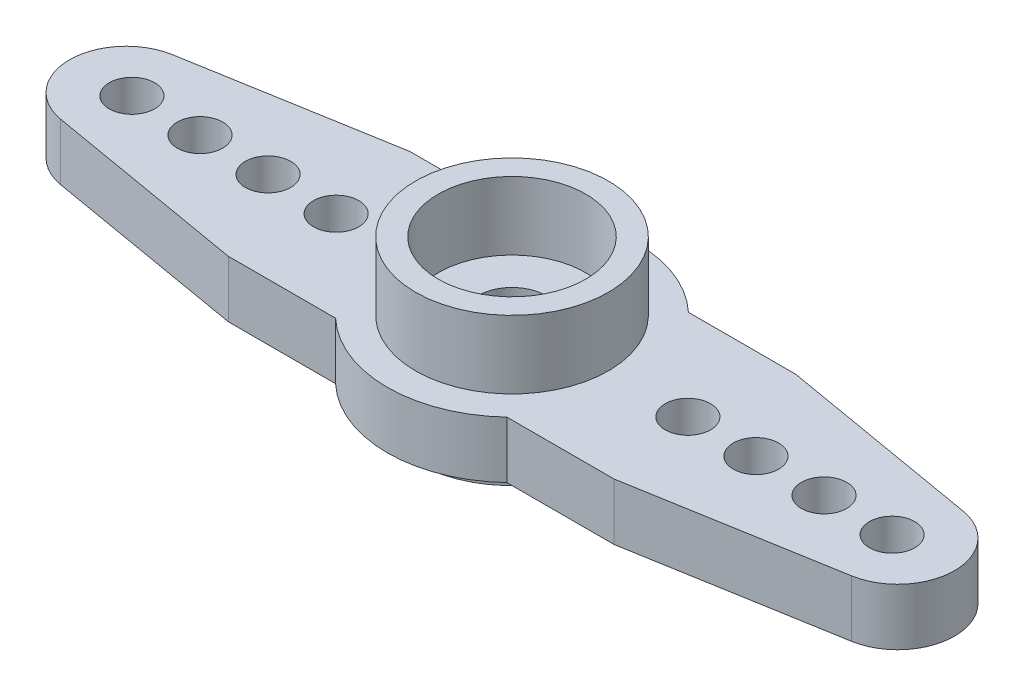
ISO-10303-21;
HEADER;
FILE_DESCRIPTION(('STEP AP214'),'2;1');
FILE_NAME('part.step','',(''),(''),'','','');
FILE_SCHEMA(('AUTOMOTIVE_DESIGN { 1 0 10303 214 1 1 1 1 }'));
ENDSEC;
DATA;
#1=APPLICATION_CONTEXT('core data for automotive mechanical design processes');
#2=APPLICATION_PROTOCOL_DEFINITION('international standard','automotive_design',2000,#1);
#3=PRODUCT_CONTEXT('',#1,'mechanical');
#4=PRODUCT('Part','Part','',(#3));
#5=PRODUCT_RELATED_PRODUCT_CATEGORY('part','',(#4));
#6=PRODUCT_DEFINITION_FORMATION('','',#4);
#7=PRODUCT_DEFINITION_CONTEXT('part definition',#1,'design');
#8=PRODUCT_DEFINITION('design','',#6,#7);
#9=PRODUCT_DEFINITION_SHAPE('','',#8);
#10=(LENGTH_UNIT() NAMED_UNIT(*) SI_UNIT(.MILLI.,.METRE.));
#11=(NAMED_UNIT(*) PLANE_ANGLE_UNIT() SI_UNIT($,.RADIAN.));
#12=(NAMED_UNIT(*) SI_UNIT($,.STERADIAN.) SOLID_ANGLE_UNIT());
#13=UNCERTAINTY_MEASURE_WITH_UNIT(LENGTH_MEASURE(1.E-05),#10,'distance_accuracy_value','');
#14=(GEOMETRIC_REPRESENTATION_CONTEXT(3) GLOBAL_UNCERTAINTY_ASSIGNED_CONTEXT((#13)) GLOBAL_UNIT_ASSIGNED_CONTEXT((#10,
#11,#12)) REPRESENTATION_CONTEXT('',''));
#15=CARTESIAN_POINT('',(0.,0.,0.));
#16=DIRECTION('',(0.,0.,1.));
#17=DIRECTION('',(1.,0.,0.));
#18=AXIS2_PLACEMENT_3D('',#15,#16,#17);
#19=CARTESIAN_POINT('',(17.,1.25,0.));
#20=DIRECTION('',(0.,-1.,0.));
#21=DIRECTION('',(0.,0.,-1.));
#22=AXIS2_PLACEMENT_3D('',#19,#20,#21);
#23=CYLINDRICAL_SURFACE('',#22,2.5);
#24=CARTESIAN_POINT('',(17.,-1.25,0.));
#25=DIRECTION('',(0.,1.,0.));
#26=DIRECTION('',(0.,0.,1.));
#27=AXIS2_PLACEMENT_3D('',#24,#25,#26);
#28=CIRCLE('',#27,2.5);
#29=CARTESIAN_POINT('',(17.4241229618286,-1.25,-2.46376129388578));
#30=VERTEX_POINT('',#29);
#31=CARTESIAN_POINT('',(17.4241229618286,-1.25,2.46376129388578));
#32=VERTEX_POINT('',#31);
#33=EDGE_CURVE('E274',#30,#32,#28,.F.);
#34=ORIENTED_EDGE('',*,*,#33,.F.);
#35=DIRECTION('',(0.,-1.,0.));
#36=VECTOR('',#35,1.);
#37=CARTESIAN_POINT('',(17.4241229618286,1.25,-2.46376129388578));
#38=LINE('',#37,#36);
#39=CARTESIAN_POINT('',(17.4241229618286,1.25,-2.46376129388578));
#40=VERTEX_POINT('',#39);
#41=EDGE_CURVE('E114',#40,#30,#38,.T.);
#42=ORIENTED_EDGE('',*,*,#41,.F.);
#43=CARTESIAN_POINT('',(17.,1.25,0.));
#44=DIRECTION('',(0.,1.,0.));
#45=DIRECTION('',(0.,0.,1.));
#46=AXIS2_PLACEMENT_3D('',#43,#44,#45);
#47=CIRCLE('',#46,2.5);
#48=CARTESIAN_POINT('',(17.4241229618286,1.25,2.46376129388578));
#49=VERTEX_POINT('',#48);
#50=EDGE_CURVE('E338',#40,#49,#47,.F.);
#51=ORIENTED_EDGE('',*,*,#50,.T.);
#52=DIRECTION('',(0.,-1.,0.));
#53=VECTOR('',#52,1.);
#54=CARTESIAN_POINT('',(17.4241229618286,1.25,2.46376129388578));
#55=LINE('',#54,#53);
#56=EDGE_CURVE('E110',#49,#32,#55,.T.);
#57=ORIENTED_EDGE('',*,*,#56,.T.);
#58=EDGE_LOOP('',(#34,#42,#51,#57));
#59=FACE_BOUND('',#58,.T.);
#60=ADVANCED_FACE('F44',(#59),#23,.T.);
#61=CARTESIAN_POINT('',(0.913397341789327,1.25,-5.30599193907388));
#62=DIRECTION('',(0.169649184731441,0.,-0.985504517554312));
#63=DIRECTION('',(-0.985504517554312,0.,-0.169649184731441));
#64=AXIS2_PLACEMENT_3D('',#61,#62,#63);
#65=PLANE('',#64);
#66=DIRECTION('',(0.985504517554312,0.,0.169649184731441));
#67=VECTOR('',#66,1.);
#68=CARTESIAN_POINT('',(0.913397341789327,-1.25,-5.30599193907388));
#69=LINE('',#68,#67);
#70=CARTESIAN_POINT('',(8.5,-1.25,-4.));
#71=VERTEX_POINT('',#70);
#72=EDGE_CURVE('E276',#71,#30,#69,.T.);
#73=ORIENTED_EDGE('',*,*,#72,.F.);
#74=DIRECTION('',(0.,-1.,0.));
#75=VECTOR('',#74,1.);
#76=CARTESIAN_POINT('',(8.5,1.25,-4.));
#77=LINE('',#76,#75);
#78=CARTESIAN_POINT('',(8.5,1.25,-4.));
#79=VERTEX_POINT('',#78);
#80=EDGE_CURVE('E183',#79,#71,#77,.T.);
#81=ORIENTED_EDGE('',*,*,#80,.F.);
#82=DIRECTION('',(0.985504517554312,0.,0.169649184731441));
#83=VECTOR('',#82,1.);
#84=CARTESIAN_POINT('',(0.913397341789327,1.25,-5.30599193907388));
#85=LINE('',#84,#83);
#86=EDGE_CURVE('E335',#79,#40,#85,.T.);
#87=ORIENTED_EDGE('',*,*,#86,.T.);
#88=ORIENTED_EDGE('',*,*,#41,.T.);
#89=EDGE_LOOP('',(#73,#81,#87,#88));
#90=FACE_BOUND('',#89,.T.);
#91=ADVANCED_FACE('F214',(#90),#65,.T.);
#92=CARTESIAN_POINT('',(0.,1.25,-4.));
#93=DIRECTION('',(0.,0.,-1.));
#94=DIRECTION('',(-1.,0.,0.));
#95=AXIS2_PLACEMENT_3D('',#92,#93,#94);
#96=PLANE('',#95);
#97=DIRECTION('',(1.,0.,0.));
#98=VECTOR('',#97,1.);
#99=CARTESIAN_POINT('',(0.,-1.25,-4.));
#100=LINE('',#99,#98);
#101=CARTESIAN_POINT('',(3.77491721763537,-1.25,-4.));
#102=VERTEX_POINT('',#101);
#103=EDGE_CURVE('E279',#102,#71,#100,.T.);
#104=ORIENTED_EDGE('',*,*,#103,.F.);
#105=DIRECTION('',(0.,-1.,0.));
#106=VECTOR('',#105,1.);
#107=CARTESIAN_POINT('',(3.77491721763537,1.25,-4.));
#108=LINE('',#107,#106);
#109=CARTESIAN_POINT('',(3.77491721763537,1.25,-4.));
#110=VERTEX_POINT('',#109);
#111=EDGE_CURVE('E181',#110,#102,#108,.T.);
#112=ORIENTED_EDGE('',*,*,#111,.F.);
#113=DIRECTION('',(1.,0.,0.));
#114=VECTOR('',#113,1.);
#115=CARTESIAN_POINT('',(0.,1.25,-4.));
#116=LINE('',#115,#114);
#117=EDGE_CURVE('E332',#110,#79,#116,.T.);
#118=ORIENTED_EDGE('',*,*,#117,.T.);
#119=ORIENTED_EDGE('',*,*,#80,.T.);
#120=EDGE_LOOP('',(#104,#112,#118,#119));
#121=FACE_BOUND('',#120,.T.);
#122=ADVANCED_FACE('F219',(#121),#96,.T.);
#123=CARTESIAN_POINT('',(0.,1.25,0.));
#124=DIRECTION('',(0.,-1.,0.));
#125=DIRECTION('',(0.,0.,-1.));
#126=AXIS2_PLACEMENT_3D('',#123,#124,#125);
#127=CYLINDRICAL_SURFACE('',#126,5.5);
#128=CARTESIAN_POINT('',(0.,-1.25,0.));
#129=DIRECTION('',(0.,1.,0.));
#130=DIRECTION('',(0.,0.,1.));
#131=AXIS2_PLACEMENT_3D('',#128,#129,#130);
#132=CIRCLE('',#131,5.5);
#133=CARTESIAN_POINT('',(-3.77491721763537,-1.25,-4.));
#134=VERTEX_POINT('',#133);
#135=EDGE_CURVE('E282',#102,#134,#132,.T.);
#136=ORIENTED_EDGE('',*,*,#135,.T.);
#137=DIRECTION('',(0.,-1.,0.));
#138=VECTOR('',#137,1.);
#139=CARTESIAN_POINT('',(-3.77491721763537,1.25,-4.));
#140=LINE('',#139,#138);
#141=CARTESIAN_POINT('',(-3.77491721763537,1.25,-4.));
#142=VERTEX_POINT('',#141);
#143=EDGE_CURVE('E179',#142,#134,#140,.T.);
#144=ORIENTED_EDGE('',*,*,#143,.F.);
#145=CARTESIAN_POINT('',(0.,1.25,0.));
#146=DIRECTION('',(0.,1.,0.));
#147=DIRECTION('',(0.,0.,1.));
#148=AXIS2_PLACEMENT_3D('',#145,#146,#147);
#149=CIRCLE('',#148,5.5);
#150=EDGE_CURVE('E330',#110,#142,#149,.T.);
#151=ORIENTED_EDGE('',*,*,#150,.F.);
#152=ORIENTED_EDGE('',*,*,#111,.T.);
#153=EDGE_LOOP('',(#136,#144,#151,#152));
#154=FACE_BOUND('',#153,.T.);
#155=ADVANCED_FACE('F460',(#154),#127,.T.);
#156=CARTESIAN_POINT('',(-8.5,-1.25,-4.));
#157=VERTEX_POINT('',#156);
#158=EDGE_CURVE('E283',#157,#134,#100,.T.);
#159=ORIENTED_EDGE('',*,*,#158,.F.);
#160=DIRECTION('',(0.,-1.,0.));
#161=VECTOR('',#160,1.);
#162=CARTESIAN_POINT('',(-8.5,1.25,-4.));
#163=LINE('',#162,#161);
#164=CARTESIAN_POINT('',(-8.5,1.25,-4.));
#165=VERTEX_POINT('',#164);
#166=EDGE_CURVE('E177',#165,#157,#163,.T.);
#167=ORIENTED_EDGE('',*,*,#166,.F.);
#168=EDGE_CURVE('E329',#165,#142,#116,.T.);
#169=ORIENTED_EDGE('',*,*,#168,.T.);
#170=ORIENTED_EDGE('',*,*,#143,.T.);
#171=EDGE_LOOP('',(#159,#167,#169,#170));
#172=FACE_BOUND('',#171,.T.);
#173=ADVANCED_FACE('F457',(#172),#96,.T.);
#174=CARTESIAN_POINT('',(-0.913397341789327,1.25,-5.30599193907388));
#175=DIRECTION('',(0.169649184731441,0.,0.985504517554312));
#176=DIRECTION('',(0.985504517554312,0.,-0.169649184731441));
#177=AXIS2_PLACEMENT_3D('',#174,#175,#176);
#178=PLANE('',#177);
#179=DIRECTION('',(-0.985504517554312,0.,0.169649184731441));
#180=VECTOR('',#179,1.);
#181=CARTESIAN_POINT('',(-0.913397341789327,-1.25,-5.30599193907388));
#182=LINE('',#181,#180);
#183=CARTESIAN_POINT('',(-17.4241229618286,-1.25,-2.46376129388578));
#184=VERTEX_POINT('',#183);
#185=EDGE_CURVE('E286',#157,#184,#182,.T.);
#186=ORIENTED_EDGE('',*,*,#185,.T.);
#187=DIRECTION('',(0.,-1.,0.));
#188=VECTOR('',#187,1.);
#189=CARTESIAN_POINT('',(-17.4241229618286,1.25,-2.46376129388578));
#190=LINE('',#189,#188);
#191=CARTESIAN_POINT('',(-17.4241229618286,1.25,-2.46376129388578));
#192=VERTEX_POINT('',#191);
#193=EDGE_CURVE('E174',#192,#184,#190,.T.);
#194=ORIENTED_EDGE('',*,*,#193,.F.);
#195=DIRECTION('',(-0.985504517554312,0.,0.169649184731441));
#196=VECTOR('',#195,1.);
#197=CARTESIAN_POINT('',(-0.913397341789327,1.25,-5.30599193907388));
#198=LINE('',#197,#196);
#199=EDGE_CURVE('E326',#165,#192,#198,.T.);
#200=ORIENTED_EDGE('',*,*,#199,.F.);
#201=ORIENTED_EDGE('',*,*,#166,.T.);
#202=EDGE_LOOP('',(#186,#194,#200,#201));
#203=FACE_BOUND('',#202,.T.);
#204=ADVANCED_FACE('F453',(#203),#178,.F.);
#205=CARTESIAN_POINT('',(-17.,1.25,0.));
#206=DIRECTION('',(0.,-1.,0.));
#207=DIRECTION('',(0.,0.,-1.));
#208=AXIS2_PLACEMENT_3D('',#205,#206,#207);
#209=CYLINDRICAL_SURFACE('',#208,2.5);
#210=CARTESIAN_POINT('',(-17.,-1.25,0.));
#211=DIRECTION('',(0.,1.,0.));
#212=DIRECTION('',(0.,0.,1.));
#213=AXIS2_PLACEMENT_3D('',#210,#211,#212);
#214=CIRCLE('',#213,2.5);
#215=CARTESIAN_POINT('',(-17.4241229618286,-1.25,2.46376129388578));
#216=VERTEX_POINT('',#215);
#217=EDGE_CURVE('E289',#184,#216,#214,.T.);
#218=ORIENTED_EDGE('',*,*,#217,.T.);
#219=DIRECTION('',(0.,-1.,0.));
#220=VECTOR('',#219,1.);
#221=CARTESIAN_POINT('',(-17.4241229618286,1.25,2.46376129388578));
#222=LINE('',#221,#220);
#223=CARTESIAN_POINT('',(-17.4241229618286,1.25,2.46376129388578));
#224=VERTEX_POINT('',#223);
#225=EDGE_CURVE('E172',#224,#216,#222,.T.);
#226=ORIENTED_EDGE('',*,*,#225,.F.);
#227=CARTESIAN_POINT('',(-17.,1.25,0.));
#228=DIRECTION('',(0.,1.,0.));
#229=DIRECTION('',(0.,0.,1.));
#230=AXIS2_PLACEMENT_3D('',#227,#228,#229);
#231=CIRCLE('',#230,2.5);
#232=EDGE_CURVE('E324',#192,#224,#231,.T.);
#233=ORIENTED_EDGE('',*,*,#232,.F.);
#234=ORIENTED_EDGE('',*,*,#193,.T.);
#235=EDGE_LOOP('',(#218,#226,#233,#234));
#236=FACE_BOUND('',#235,.T.);
#237=ADVANCED_FACE('F449',(#236),#209,.T.);
#238=CARTESIAN_POINT('',(-0.913397341789328,1.25,5.30599193907388));
#239=DIRECTION('',(-0.169649184731441,0.,0.985504517554312));
#240=DIRECTION('',(0.985504517554312,0.,0.169649184731441));
#241=AXIS2_PLACEMENT_3D('',#238,#239,#240);
#242=PLANE('',#241);
#243=DIRECTION('',(-0.985504517554312,0.,-0.169649184731441));
#244=VECTOR('',#243,1.);
#245=CARTESIAN_POINT('',(-0.913397341789328,-1.25,5.30599193907388));
#246=LINE('',#245,#244);
#247=CARTESIAN_POINT('',(-8.5,-1.25,4.));
#248=VERTEX_POINT('',#247);
#249=EDGE_CURVE('E292',#248,#216,#246,.T.);
#250=ORIENTED_EDGE('',*,*,#249,.F.);
#251=DIRECTION('',(0.,-1.,0.));
#252=VECTOR('',#251,1.);
#253=CARTESIAN_POINT('',(-8.5,1.25,4.));
#254=LINE('',#253,#252);
#255=CARTESIAN_POINT('',(-8.5,1.25,4.));
#256=VERTEX_POINT('',#255);
#257=EDGE_CURVE('E166',#256,#248,#254,.T.);
#258=ORIENTED_EDGE('',*,*,#257,.F.);
#259=DIRECTION('',(-0.985504517554312,0.,-0.169649184731441));
#260=VECTOR('',#259,1.);
#261=CARTESIAN_POINT('',(-0.913397341789328,1.25,5.30599193907388));
#262=LINE('',#261,#260);
#263=EDGE_CURVE('E321',#256,#224,#262,.T.);
#264=ORIENTED_EDGE('',*,*,#263,.T.);
#265=ORIENTED_EDGE('',*,*,#225,.T.);
#266=EDGE_LOOP('',(#250,#258,#264,#265));
#267=FACE_BOUND('',#266,.T.);
#268=ADVANCED_FACE('F446',(#267),#242,.T.);
#269=CARTESIAN_POINT('',(0.,1.25,4.));
#270=DIRECTION('',(0.,0.,-1.));
#271=DIRECTION('',(-1.,0.,0.));
#272=AXIS2_PLACEMENT_3D('',#269,#270,#271);
#273=PLANE('',#272);
#274=DIRECTION('',(1.,0.,0.));
#275=VECTOR('',#274,1.);
#276=CARTESIAN_POINT('',(0.,-1.25,4.));
#277=LINE('',#276,#275);
#278=CARTESIAN_POINT('',(-3.77491721763537,-1.25,4.));
#279=VERTEX_POINT('',#278);
#280=EDGE_CURVE('E295',#248,#279,#277,.T.);
#281=ORIENTED_EDGE('',*,*,#280,.T.);
#282=DIRECTION('',(0.,-1.,0.));
#283=VECTOR('',#282,1.);
#284=CARTESIAN_POINT('',(-3.77491721763537,1.25,4.));
#285=LINE('',#284,#283);
#286=CARTESIAN_POINT('',(-3.77491721763537,1.25,4.));
#287=VERTEX_POINT('',#286);
#288=EDGE_CURVE('E164',#287,#279,#285,.T.);
#289=ORIENTED_EDGE('',*,*,#288,.F.);
#290=DIRECTION('',(1.,0.,0.));
#291=VECTOR('',#290,1.);
#292=CARTESIAN_POINT('',(0.,1.25,4.));
#293=LINE('',#292,#291);
#294=EDGE_CURVE('E152',#256,#287,#293,.T.);
#295=ORIENTED_EDGE('',*,*,#294,.F.);
#296=ORIENTED_EDGE('',*,*,#257,.T.);
#297=EDGE_LOOP('',(#281,#289,#295,#296));
#298=FACE_BOUND('',#297,.T.);
#299=ADVANCED_FACE('F441',(#298),#273,.F.);
#300=CARTESIAN_POINT('',(0.,1.25,0.));
#301=DIRECTION('',(0.,-1.,0.));
#302=DIRECTION('',(0.,0.,-1.));
#303=AXIS2_PLACEMENT_3D('',#300,#301,#302);
#304=CYLINDRICAL_SURFACE('',#303,5.5);
#305=CARTESIAN_POINT('',(0.,-1.25,0.));
#306=DIRECTION('',(0.,1.,0.));
#307=DIRECTION('',(0.,0.,1.));
#308=AXIS2_PLACEMENT_3D('',#305,#306,#307);
#309=CIRCLE('',#308,5.5);
#310=CARTESIAN_POINT('',(3.77491721763537,-1.25,4.));
#311=VERTEX_POINT('',#310);
#312=EDGE_CURVE('E163',#279,#311,#309,.T.);
#313=ORIENTED_EDGE('',*,*,#312,.T.);
#314=DIRECTION('',(0.,-1.,0.));
#315=VECTOR('',#314,1.);
#316=CARTESIAN_POINT('',(3.77491721763537,1.25,4.));
#317=LINE('',#316,#315);
#318=CARTESIAN_POINT('',(3.77491721763537,1.25,4.));
#319=VERTEX_POINT('',#318);
#320=EDGE_CURVE('E147',#319,#311,#317,.T.);
#321=ORIENTED_EDGE('',*,*,#320,.F.);
#322=CARTESIAN_POINT('',(0.,1.25,0.));
#323=DIRECTION('',(0.,1.,0.));
#324=DIRECTION('',(0.,0.,1.));
#325=AXIS2_PLACEMENT_3D('',#322,#323,#324);
#326=CIRCLE('',#325,5.5);
#327=EDGE_CURVE('E150',#287,#319,#326,.T.);
#328=ORIENTED_EDGE('',*,*,#327,.F.);
#329=ORIENTED_EDGE('',*,*,#288,.T.);
#330=EDGE_LOOP('',(#313,#321,#328,#329));
#331=FACE_BOUND('',#330,.T.);
#332=ADVANCED_FACE('F162',(#331),#304,.T.);
#333=CARTESIAN_POINT('',(8.5,-1.25,4.));
#334=VERTEX_POINT('',#333);
#335=EDGE_CURVE('E298',#311,#334,#277,.T.);
#336=ORIENTED_EDGE('',*,*,#335,.T.);
#337=DIRECTION('',(0.,-1.,0.));
#338=VECTOR('',#337,1.);
#339=CARTESIAN_POINT('',(8.5,1.25,4.));
#340=LINE('',#339,#338);
#341=CARTESIAN_POINT('',(8.5,1.25,4.));
#342=VERTEX_POINT('',#341);
#343=EDGE_CURVE('E149',#342,#334,#340,.T.);
#344=ORIENTED_EDGE('',*,*,#343,.F.);
#345=EDGE_CURVE('E142',#319,#342,#293,.T.);
#346=ORIENTED_EDGE('',*,*,#345,.F.);
#347=ORIENTED_EDGE('',*,*,#320,.T.);
#348=EDGE_LOOP('',(#336,#344,#346,#347));
#349=FACE_BOUND('',#348,.T.);
#350=ADVANCED_FACE('F145',(#349),#273,.F.);
#351=CARTESIAN_POINT('',(-13.75,1.25,0.));
#352=DIRECTION('',(0.,-1.,0.));
#353=DIRECTION('',(0.,0.,-1.));
#354=AXIS2_PLACEMENT_3D('',#351,#352,#353);
#355=CYLINDRICAL_SURFACE('',#354,1.);
#356=CARTESIAN_POINT('',(-13.75,1.25,0.));
#357=DIRECTION('',(0.,1.,0.));
#358=DIRECTION('',(0.,0.,1.));
#359=AXIS2_PLACEMENT_3D('',#356,#357,#358);
#360=CIRCLE('',#359,1.);
#361=CARTESIAN_POINT('',(-13.75,1.25,1.));
#362=VERTEX_POINT('',#361);
#363=EDGE_CURVE('E311',#362,#362,#360,.F.);
#364=ORIENTED_EDGE('',*,*,#363,.F.);
#365=EDGE_LOOP('',(#364));
#366=FACE_BOUND('',#365,.T.);
#367=CARTESIAN_POINT('',(-13.75,-1.25,0.));
#368=DIRECTION('',(0.,1.,0.));
#369=DIRECTION('',(0.,0.,1.));
#370=AXIS2_PLACEMENT_3D('',#367,#368,#369);
#371=CIRCLE('',#370,1.);
#372=CARTESIAN_POINT('',(-13.75,-1.25,1.));
#373=VERTEX_POINT('',#372);
#374=EDGE_CURVE('E303',#373,#373,#371,.F.);
#375=ORIENTED_EDGE('',*,*,#374,.T.);
#376=EDGE_LOOP('',(#375));
#377=FACE_BOUND('',#376,.T.);
#378=ADVANCED_FACE('F430',(#366,#377),#355,.F.);
#379=CARTESIAN_POINT('',(0.913397341789328,1.25,5.30599193907388));
#380=DIRECTION('',(-0.169649184731441,0.,-0.985504517554312));
#381=DIRECTION('',(-0.985504517554312,0.,0.169649184731441));
#382=AXIS2_PLACEMENT_3D('',#379,#380,#381);
#383=PLANE('',#382);
#384=DIRECTION('',(0.985504517554312,0.,-0.169649184731441));
#385=VECTOR('',#384,1.);
#386=CARTESIAN_POINT('',(0.913397341789328,-1.25,5.30599193907388));
#387=LINE('',#386,#385);
#388=EDGE_CURVE('E103',#334,#32,#387,.T.);
#389=ORIENTED_EDGE('',*,*,#388,.T.);
#390=ORIENTED_EDGE('',*,*,#56,.F.);
#391=DIRECTION('',(0.985504517554312,0.,-0.169649184731441));
#392=VECTOR('',#391,1.);
#393=CARTESIAN_POINT('',(0.913397341789328,1.25,5.30599193907388));
#394=LINE('',#393,#392);
#395=EDGE_CURVE('E63',#342,#49,#394,.T.);
#396=ORIENTED_EDGE('',*,*,#395,.F.);
#397=ORIENTED_EDGE('',*,*,#343,.T.);
#398=EDGE_LOOP('',(#389,#390,#396,#397));
#399=FACE_BOUND('',#398,.T.);
#400=ADVANCED_FACE('F228',(#399),#383,.F.);
#401=CARTESIAN_POINT('',(7.75,1.25,0.));
#402=DIRECTION('',(0.,-1.,0.));
#403=DIRECTION('',(0.,0.,-1.));
#404=AXIS2_PLACEMENT_3D('',#401,#402,#403);
#405=CYLINDRICAL_SURFACE('',#404,1.);
#406=CARTESIAN_POINT('',(7.75,1.25,0.));
#407=DIRECTION('',(0.,1.,0.));
#408=DIRECTION('',(0.,0.,1.));
#409=AXIS2_PLACEMENT_3D('',#406,#407,#408);
#410=CIRCLE('',#409,1.);
#411=CARTESIAN_POINT('',(7.75,1.25,1.));
#412=VERTEX_POINT('',#411);
#413=EDGE_CURVE('E340',#412,#412,#410,.T.);
#414=ORIENTED_EDGE('',*,*,#413,.T.);
#415=EDGE_LOOP('',(#414));
#416=FACE_BOUND('',#415,.T.);
#417=CARTESIAN_POINT('',(7.75,-1.25,0.));
#418=DIRECTION('',(0.,1.,0.));
#419=DIRECTION('',(0.,0.,1.));
#420=AXIS2_PLACEMENT_3D('',#417,#418,#419);
#421=CIRCLE('',#420,1.);
#422=CARTESIAN_POINT('',(7.75,-1.25,1.));
#423=VERTEX_POINT('',#422);
#424=EDGE_CURVE('E271',#423,#423,#421,.T.);
#425=ORIENTED_EDGE('',*,*,#424,.F.);
#426=EDGE_LOOP('',(#425));
#427=FACE_BOUND('',#426,.T.);
#428=ADVANCED_FACE('F224',(#416,#427),#405,.F.);
#429=CARTESIAN_POINT('',(10.75,1.25,0.));
#430=DIRECTION('',(0.,-1.,0.));
#431=DIRECTION('',(0.,0.,-1.));
#432=AXIS2_PLACEMENT_3D('',#429,#430,#431);
#433=CYLINDRICAL_SURFACE('',#432,1.);
#434=CARTESIAN_POINT('',(10.75,1.25,0.));
#435=DIRECTION('',(0.,1.,0.));
#436=DIRECTION('',(0.,0.,1.));
#437=AXIS2_PLACEMENT_3D('',#434,#435,#436);
#438=CIRCLE('',#437,1.);
#439=CARTESIAN_POINT('',(10.75,1.25,1.));
#440=VERTEX_POINT('',#439);
#441=EDGE_CURVE('E343',#440,#440,#438,.T.);
#442=ORIENTED_EDGE('',*,*,#441,.T.);
#443=EDGE_LOOP('',(#442));
#444=FACE_BOUND('',#443,.T.);
#445=CARTESIAN_POINT('',(10.75,-1.25,0.));
#446=DIRECTION('',(0.,1.,0.));
#447=DIRECTION('',(0.,0.,1.));
#448=AXIS2_PLACEMENT_3D('',#445,#446,#447);
#449=CIRCLE('',#448,1.);
#450=CARTESIAN_POINT('',(10.75,-1.25,1.));
#451=VERTEX_POINT('',#450);
#452=EDGE_CURVE('E268',#451,#451,#449,.T.);
#453=ORIENTED_EDGE('',*,*,#452,.F.);
#454=EDGE_LOOP('',(#453));
#455=FACE_BOUND('',#454,.T.);
#456=ADVANCED_FACE('F227',(#444,#455),#433,.F.);
#457=CARTESIAN_POINT('',(13.75,1.25,0.));
#458=DIRECTION('',(0.,-1.,0.));
#459=DIRECTION('',(0.,0.,-1.));
#460=AXIS2_PLACEMENT_3D('',#457,#458,#459);
#461=CYLINDRICAL_SURFACE('',#460,1.);
#462=CARTESIAN_POINT('',(13.75,1.25,0.));
#463=DIRECTION('',(0.,1.,0.));
#464=DIRECTION('',(0.,0.,1.));
#465=AXIS2_PLACEMENT_3D('',#462,#463,#464);
#466=CIRCLE('',#465,1.);
#467=CARTESIAN_POINT('',(13.75,1.25,1.));
#468=VERTEX_POINT('',#467);
#469=EDGE_CURVE('E346',#468,#468,#466,.T.);
#470=ORIENTED_EDGE('',*,*,#469,.T.);
#471=EDGE_LOOP('',(#470));
#472=FACE_BOUND('',#471,.T.);
#473=CARTESIAN_POINT('',(13.75,-1.25,0.));
#474=DIRECTION('',(0.,1.,0.));
#475=DIRECTION('',(0.,0.,1.));
#476=AXIS2_PLACEMENT_3D('',#473,#474,#475);
#477=CIRCLE('',#476,1.);
#478=CARTESIAN_POINT('',(13.75,-1.25,1.));
#479=VERTEX_POINT('',#478);
#480=EDGE_CURVE('E260',#479,#479,#477,.T.);
#481=ORIENTED_EDGE('',*,*,#480,.F.);
#482=EDGE_LOOP('',(#481));
#483=FACE_BOUND('',#482,.T.);
#484=ADVANCED_FACE('F232',(#472,#483),#461,.F.);
#485=CARTESIAN_POINT('',(16.75,1.25,0.));
#486=DIRECTION('',(0.,-1.,0.));
#487=DIRECTION('',(0.,0.,-1.));
#488=AXIS2_PLACEMENT_3D('',#485,#486,#487);
#489=CYLINDRICAL_SURFACE('',#488,1.);
#490=CARTESIAN_POINT('',(16.75,1.25,0.));
#491=DIRECTION('',(0.,1.,0.));
#492=DIRECTION('',(0.,0.,1.));
#493=AXIS2_PLACEMENT_3D('',#490,#491,#492);
#494=CIRCLE('',#493,1.);
#495=CARTESIAN_POINT('',(16.75,1.25,1.));
#496=VERTEX_POINT('',#495);
#497=EDGE_CURVE('E349',#496,#496,#494,.T.);
#498=ORIENTED_EDGE('',*,*,#497,.T.);
#499=EDGE_LOOP('',(#498));
#500=FACE_BOUND('',#499,.T.);
#501=CARTESIAN_POINT('',(16.75,-1.25,0.));
#502=DIRECTION('',(0.,1.,0.));
#503=DIRECTION('',(0.,0.,1.));
#504=AXIS2_PLACEMENT_3D('',#501,#502,#503);
#505=CIRCLE('',#504,1.);
#506=CARTESIAN_POINT('',(16.75,-1.25,1.));
#507=VERTEX_POINT('',#506);
#508=EDGE_CURVE('E256',#507,#507,#505,.T.);
#509=ORIENTED_EDGE('',*,*,#508,.F.);
#510=EDGE_LOOP('',(#509));
#511=FACE_BOUND('',#510,.T.);
#512=ADVANCED_FACE('F236',(#500,#511),#489,.F.);
#513=CARTESIAN_POINT('',(-16.75,1.25,0.));
#514=DIRECTION('',(0.,-1.,0.));
#515=DIRECTION('',(0.,0.,-1.));
#516=AXIS2_PLACEMENT_3D('',#513,#514,#515);
#517=CYLINDRICAL_SURFACE('',#516,0.999999999999995);
#518=CARTESIAN_POINT('',(-16.75,1.25,0.));
#519=DIRECTION('',(0.,1.,0.));
#520=DIRECTION('',(0.,0.,1.));
#521=AXIS2_PLACEMENT_3D('',#518,#519,#520);
#522=CIRCLE('',#521,0.999999999999995);
#523=CARTESIAN_POINT('',(-16.75,1.25,0.999999999999995));
#524=VERTEX_POINT('',#523);
#525=EDGE_CURVE('E251',#524,#524,#522,.F.);
#526=ORIENTED_EDGE('',*,*,#525,.F.);
#527=EDGE_LOOP('',(#526));
#528=FACE_BOUND('',#527,.T.);
#529=CARTESIAN_POINT('',(-16.75,-1.25,0.));
#530=DIRECTION('',(0.,1.,0.));
#531=DIRECTION('',(0.,0.,1.));
#532=AXIS2_PLACEMENT_3D('',#529,#530,#531);
#533=CIRCLE('',#532,0.999999999999995);
#534=CARTESIAN_POINT('',(-16.75,-1.25,0.999999999999995));
#535=VERTEX_POINT('',#534);
#536=EDGE_CURVE('E254',#535,#535,#533,.F.);
#537=ORIENTED_EDGE('',*,*,#536,.T.);
#538=EDGE_LOOP('',(#537));
#539=FACE_BOUND('',#538,.T.);
#540=ADVANCED_FACE('F239',(#528,#539),#517,.F.);
#541=CARTESIAN_POINT('',(-7.75,1.25,0.));
#542=DIRECTION('',(0.,-1.,0.));
#543=DIRECTION('',(0.,0.,-1.));
#544=AXIS2_PLACEMENT_3D('',#541,#542,#543);
#545=CYLINDRICAL_SURFACE('',#544,1.);
#546=CARTESIAN_POINT('',(-7.75,1.25,0.));
#547=DIRECTION('',(0.,1.,0.));
#548=DIRECTION('',(0.,0.,1.));
#549=AXIS2_PLACEMENT_3D('',#546,#547,#548);
#550=CIRCLE('',#549,1.);
#551=CARTESIAN_POINT('',(-7.75,1.25,1.));
#552=VERTEX_POINT('',#551);
#553=EDGE_CURVE('E308',#552,#552,#550,.F.);
#554=ORIENTED_EDGE('',*,*,#553,.F.);
#555=EDGE_LOOP('',(#554));
#556=FACE_BOUND('',#555,.T.);
#557=CARTESIAN_POINT('',(-7.75,-1.25,0.));
#558=DIRECTION('',(0.,1.,0.));
#559=DIRECTION('',(0.,0.,1.));
#560=AXIS2_PLACEMENT_3D('',#557,#558,#559);
#561=CIRCLE('',#560,1.);
#562=CARTESIAN_POINT('',(-7.75,-1.25,1.));
#563=VERTEX_POINT('',#562);
#564=EDGE_CURVE('E257',#563,#563,#561,.F.);
#565=ORIENTED_EDGE('',*,*,#564,.T.);
#566=EDGE_LOOP('',(#565));
#567=FACE_BOUND('',#566,.T.);
#568=ADVANCED_FACE('F46',(#556,#567),#545,.F.);
#569=CARTESIAN_POINT('',(-10.75,1.25,0.));
#570=DIRECTION('',(0.,-1.,0.));
#571=DIRECTION('',(0.,0.,-1.));
#572=AXIS2_PLACEMENT_3D('',#569,#570,#571);
#573=CYLINDRICAL_SURFACE('',#572,1.);
#574=CARTESIAN_POINT('',(-10.75,1.25,0.));
#575=DIRECTION('',(0.,1.,0.));
#576=DIRECTION('',(0.,0.,1.));
#577=AXIS2_PLACEMENT_3D('',#574,#575,#576);
#578=CIRCLE('',#577,1.);
#579=CARTESIAN_POINT('',(-10.75,1.25,1.));
#580=VERTEX_POINT('',#579);
#581=EDGE_CURVE('E309',#580,#580,#578,.F.);
#582=ORIENTED_EDGE('',*,*,#581,.F.);
#583=EDGE_LOOP('',(#582));
#584=FACE_BOUND('',#583,.T.);
#585=CARTESIAN_POINT('',(-10.75,-1.25,0.));
#586=DIRECTION('',(0.,1.,0.));
#587=DIRECTION('',(0.,0.,1.));
#588=AXIS2_PLACEMENT_3D('',#585,#586,#587);
#589=CIRCLE('',#588,1.);
#590=CARTESIAN_POINT('',(-10.75,-1.25,1.));
#591=VERTEX_POINT('',#590);
#592=EDGE_CURVE('E306',#591,#591,#589,.F.);
#593=ORIENTED_EDGE('',*,*,#592,.T.);
#594=EDGE_LOOP('',(#593));
#595=FACE_BOUND('',#594,.T.);
#596=ADVANCED_FACE('F246',(#584,#595),#573,.F.);
#597=CARTESIAN_POINT('',(0.,1.25,0.));
#598=DIRECTION('',(0.,1.,0.));
#599=DIRECTION('',(0.,0.,1.));
#600=AXIS2_PLACEMENT_3D('',#597,#598,#599);
#601=PLANE('',#600);
#602=CARTESIAN_POINT('',(0.,1.25,0.));
#603=DIRECTION('',(0.,1.,0.));
#604=DIRECTION('',(0.,0.,1.));
#605=AXIS2_PLACEMENT_3D('',#602,#603,#604);
#606=CIRCLE('',#605,4.25);
#607=CARTESIAN_POINT('',(0.,1.25,4.25));
#608=VERTEX_POINT('',#607);
#609=EDGE_CURVE('E11',#608,#608,#606,.T.);
#610=ORIENTED_EDGE('',*,*,#609,.F.);
#611=EDGE_LOOP('',(#610));
#612=FACE_BOUND('',#611,.T.);
#613=ORIENTED_EDGE('',*,*,#553,.T.);
#614=EDGE_LOOP('',(#613));
#615=FACE_BOUND('',#614,.T.);
#616=ORIENTED_EDGE('',*,*,#525,.T.);
#617=EDGE_LOOP('',(#616));
#618=FACE_BOUND('',#617,.T.);
#619=ORIENTED_EDGE('',*,*,#497,.F.);
#620=EDGE_LOOP('',(#619));
#621=FACE_BOUND('',#620,.T.);
#622=ORIENTED_EDGE('',*,*,#469,.F.);
#623=EDGE_LOOP('',(#622));
#624=FACE_BOUND('',#623,.T.);
#625=ORIENTED_EDGE('',*,*,#441,.F.);
#626=EDGE_LOOP('',(#625));
#627=FACE_BOUND('',#626,.T.);
#628=ORIENTED_EDGE('',*,*,#413,.F.);
#629=EDGE_LOOP('',(#628));
#630=FACE_BOUND('',#629,.T.);
#631=ORIENTED_EDGE('',*,*,#50,.F.);
#632=ORIENTED_EDGE('',*,*,#86,.F.);
#633=ORIENTED_EDGE('',*,*,#117,.F.);
#634=ORIENTED_EDGE('',*,*,#150,.T.);
#635=ORIENTED_EDGE('',*,*,#168,.F.);
#636=ORIENTED_EDGE('',*,*,#199,.T.);
#637=ORIENTED_EDGE('',*,*,#232,.T.);
#638=ORIENTED_EDGE('',*,*,#263,.F.);
#639=ORIENTED_EDGE('',*,*,#294,.T.);
#640=ORIENTED_EDGE('',*,*,#327,.T.);
#641=ORIENTED_EDGE('',*,*,#345,.T.);
#642=ORIENTED_EDGE('',*,*,#395,.T.);
#643=EDGE_LOOP('',(#631,#632,#633,#634,#635,#636,#637,#638,#639,#640,#641,#642));
#644=FACE_BOUND('',#643,.T.);
#645=ORIENTED_EDGE('',*,*,#363,.T.);
#646=EDGE_LOOP('',(#645));
#647=FACE_BOUND('',#646,.T.);
#648=ORIENTED_EDGE('',*,*,#581,.T.);
#649=EDGE_LOOP('',(#648));
#650=FACE_BOUND('',#649,.T.);
#651=ADVANCED_FACE('F154',(#612,#615,#618,#621,#624,#627,#630,#644,#647,#650),#601,.T.);
#652=CARTESIAN_POINT('',(0.,-1.25,0.));
#653=DIRECTION('',(0.,1.,0.));
#654=DIRECTION('',(0.,0.,1.));
#655=AXIS2_PLACEMENT_3D('',#652,#653,#654);
#656=PLANE('',#655);
#657=CARTESIAN_POINT('',(0.,-1.25,0.));
#658=DIRECTION('',(0.,1.,0.));
#659=DIRECTION('',(0.,0.,1.));
#660=AXIS2_PLACEMENT_3D('',#657,#658,#659);
#661=CIRCLE('',#660,4.25);
#662=CARTESIAN_POINT('',(0.,-1.25,4.25));
#663=VERTEX_POINT('',#662);
#664=EDGE_CURVE('E48',#663,#663,#661,.T.);
#665=ORIENTED_EDGE('',*,*,#664,.T.);
#666=EDGE_LOOP('',(#665));
#667=FACE_BOUND('',#666,.T.);
#668=ORIENTED_EDGE('',*,*,#564,.F.);
#669=EDGE_LOOP('',(#668));
#670=FACE_BOUND('',#669,.T.);
#671=ORIENTED_EDGE('',*,*,#536,.F.);
#672=EDGE_LOOP('',(#671));
#673=FACE_BOUND('',#672,.T.);
#674=ORIENTED_EDGE('',*,*,#508,.T.);
#675=EDGE_LOOP('',(#674));
#676=FACE_BOUND('',#675,.T.);
#677=ORIENTED_EDGE('',*,*,#480,.T.);
#678=EDGE_LOOP('',(#677));
#679=FACE_BOUND('',#678,.T.);
#680=ORIENTED_EDGE('',*,*,#452,.T.);
#681=EDGE_LOOP('',(#680));
#682=FACE_BOUND('',#681,.T.);
#683=ORIENTED_EDGE('',*,*,#424,.T.);
#684=EDGE_LOOP('',(#683));
#685=FACE_BOUND('',#684,.T.);
#686=ORIENTED_EDGE('',*,*,#33,.T.);
#687=ORIENTED_EDGE('',*,*,#388,.F.);
#688=ORIENTED_EDGE('',*,*,#335,.F.);
#689=ORIENTED_EDGE('',*,*,#312,.F.);
#690=ORIENTED_EDGE('',*,*,#280,.F.);
#691=ORIENTED_EDGE('',*,*,#249,.T.);
#692=ORIENTED_EDGE('',*,*,#217,.F.);
#693=ORIENTED_EDGE('',*,*,#185,.F.);
#694=ORIENTED_EDGE('',*,*,#158,.T.);
#695=ORIENTED_EDGE('',*,*,#135,.F.);
#696=ORIENTED_EDGE('',*,*,#103,.T.);
#697=ORIENTED_EDGE('',*,*,#72,.T.);
#698=EDGE_LOOP('',(#686,#687,#688,#689,#690,#691,#692,#693,#694,#695,#696,#697));
#699=FACE_BOUND('',#698,.T.);
#700=ORIENTED_EDGE('',*,*,#374,.F.);
#701=EDGE_LOOP('',(#700));
#702=FACE_BOUND('',#701,.T.);
#703=ORIENTED_EDGE('',*,*,#592,.F.);
#704=EDGE_LOOP('',(#703));
#705=FACE_BOUND('',#704,.T.);
#706=ADVANCED_FACE('F196',(#667,#670,#673,#676,#679,#682,#685,#699,#702,#705),#656,.F.);
#707=CARTESIAN_POINT('',(0.,-2.25,0.));
#708=DIRECTION('',(0.,1.,0.));
#709=DIRECTION('',(0.,0.,1.));
#710=AXIS2_PLACEMENT_3D('',#707,#708,#709);
#711=CYLINDRICAL_SURFACE('',#710,4.25);
#712=CARTESIAN_POINT('',(0.,-2.25,0.));
#713=DIRECTION('',(0.,1.,0.));
#714=DIRECTION('',(0.,0.,1.));
#715=AXIS2_PLACEMENT_3D('',#712,#713,#714);
#716=CIRCLE('',#715,4.25);
#717=CARTESIAN_POINT('',(0.,-2.25,4.25));
#718=VERTEX_POINT('',#717);
#719=EDGE_CURVE('E358',#718,#718,#716,.T.);
#720=ORIENTED_EDGE('',*,*,#719,.T.);
#721=EDGE_LOOP('',(#720));
#722=FACE_BOUND('',#721,.T.);
#723=ORIENTED_EDGE('',*,*,#664,.F.);
#724=EDGE_LOOP('',(#723));
#725=FACE_BOUND('',#724,.T.);
#726=ADVANCED_FACE('F204',(#722,#725),#711,.T.);
#727=CARTESIAN_POINT('',(0.,-2.25,0.));
#728=DIRECTION('',(0.,1.,0.));
#729=DIRECTION('',(0.,0.,1.));
#730=AXIS2_PLACEMENT_3D('',#727,#728,#729);
#731=PLANE('',#730);
#732=CARTESIAN_POINT('',(0.,-2.25,0.));
#733=DIRECTION('',(0.,1.,0.));
#734=DIRECTION('',(0.,0.,1.));
#735=AXIS2_PLACEMENT_3D('',#732,#733,#734);
#736=CIRCLE('',#735,3.25);
#737=CARTESIAN_POINT('',(0.,-2.25,3.25));
#738=VERTEX_POINT('',#737);
#739=EDGE_CURVE('E361',#738,#738,#736,.T.);
#740=ORIENTED_EDGE('',*,*,#739,.T.);
#741=EDGE_LOOP('',(#740));
#742=FACE_BOUND('',#741,.T.);
#743=ORIENTED_EDGE('',*,*,#719,.F.);
#744=EDGE_LOOP('',(#743));
#745=FACE_BOUND('',#744,.T.);
#746=ADVANCED_FACE('F382',(#742,#745),#731,.F.);
#747=CARTESIAN_POINT('',(0.,-2.25,0.));
#748=DIRECTION('',(0.,1.,0.));
#749=DIRECTION('',(0.,0.,1.));
#750=AXIS2_PLACEMENT_3D('',#747,#748,#749);
#751=CYLINDRICAL_SURFACE('',#750,3.25);
#752=ORIENTED_EDGE('',*,*,#739,.F.);
#753=EDGE_LOOP('',(#752));
#754=FACE_BOUND('',#753,.T.);
#755=CARTESIAN_POINT('',(0.,-1.25,0.));
#756=DIRECTION('',(0.,1.,0.));
#757=DIRECTION('',(0.,0.,1.));
#758=AXIS2_PLACEMENT_3D('',#755,#756,#757);
#759=CIRCLE('',#758,3.25);
#760=CARTESIAN_POINT('',(0.,-1.25,3.25));
#761=VERTEX_POINT('',#760);
#762=EDGE_CURVE('E54',#761,#761,#759,.T.);
#763=ORIENTED_EDGE('',*,*,#762,.T.);
#764=EDGE_LOOP('',(#763));
#765=FACE_BOUND('',#764,.T.);
#766=ADVANCED_FACE('F188',(#754,#765),#751,.F.);
#767=CARTESIAN_POINT('',(0.,1.25,0.));
#768=DIRECTION('',(0.,1.,0.));
#769=DIRECTION('',(0.,0.,1.));
#770=AXIS2_PLACEMENT_3D('',#767,#768,#769);
#771=CIRCLE('',#770,1.5);
#772=CARTESIAN_POINT('',(0.,1.25,1.5));
#773=VERTEX_POINT('',#772);
#774=EDGE_CURVE('E315',#773,#773,#771,.T.);
#775=ORIENTED_EDGE('',*,*,#774,.F.);
#776=EDGE_LOOP('',(#775));
#777=FACE_BOUND('',#776,.T.);
#778=CARTESIAN_POINT('',(0.,1.25,0.));
#779=DIRECTION('',(0.,1.,0.));
#780=DIRECTION('',(0.,0.,1.));
#781=AXIS2_PLACEMENT_3D('',#778,#779,#780);
#782=CIRCLE('',#781,3.25);
#783=CARTESIAN_POINT('',(0.,1.25,3.25));
#784=VERTEX_POINT('',#783);
#785=EDGE_CURVE('E355',#784,#784,#782,.T.);
#786=ORIENTED_EDGE('',*,*,#785,.T.);
#787=EDGE_LOOP('',(#786));
#788=FACE_BOUND('',#787,.T.);
#789=ADVANCED_FACE('F205',(#777,#788),#601,.T.);
#790=CARTESIAN_POINT('',(0.,1.25,0.));
#791=DIRECTION('',(0.,-1.,0.));
#792=DIRECTION('',(0.,0.,-1.));
#793=AXIS2_PLACEMENT_3D('',#790,#791,#792);
#794=CYLINDRICAL_SURFACE('',#793,1.5);
#795=ORIENTED_EDGE('',*,*,#774,.T.);
#796=EDGE_LOOP('',(#795));
#797=FACE_BOUND('',#796,.T.);
#798=CARTESIAN_POINT('',(0.,-1.25,0.));
#799=DIRECTION('',(0.,1.,0.));
#800=DIRECTION('',(0.,0.,1.));
#801=AXIS2_PLACEMENT_3D('',#798,#799,#800);
#802=CIRCLE('',#801,1.5);
#803=CARTESIAN_POINT('',(0.,-1.25,1.5));
#804=VERTEX_POINT('',#803);
#805=EDGE_CURVE('E301',#804,#804,#802,.T.);
#806=ORIENTED_EDGE('',*,*,#805,.F.);
#807=EDGE_LOOP('',(#806));
#808=FACE_BOUND('',#807,.T.);
#809=ADVANCED_FACE('F193',(#797,#808),#794,.F.);
#810=ORIENTED_EDGE('',*,*,#805,.T.);
#811=EDGE_LOOP('',(#810));
#812=FACE_BOUND('',#811,.T.);
#813=ORIENTED_EDGE('',*,*,#762,.F.);
#814=EDGE_LOOP('',(#813));
#815=FACE_BOUND('',#814,.T.);
#816=ADVANCED_FACE('F190',(#812,#815),#656,.F.);
#817=ORIENTED_EDGE('',*,*,#609,.T.);
#818=EDGE_LOOP('',(#817));
#819=FACE_BOUND('',#818,.T.);
#820=CARTESIAN_POINT('',(0.,4.25,0.));
#821=DIRECTION('',(0.,1.,0.));
#822=DIRECTION('',(0.,0.,1.));
#823=AXIS2_PLACEMENT_3D('',#820,#821,#822);
#824=CIRCLE('',#823,4.25);
#825=CARTESIAN_POINT('',(0.,4.25,4.25));
#826=VERTEX_POINT('',#825);
#827=EDGE_CURVE('E364',#826,#826,#824,.T.);
#828=ORIENTED_EDGE('',*,*,#827,.F.);
#829=EDGE_LOOP('',(#828));
#830=FACE_BOUND('',#829,.T.);
#831=ADVANCED_FACE('F192',(#819,#830),#711,.T.);
#832=ORIENTED_EDGE('',*,*,#785,.F.);
#833=EDGE_LOOP('',(#832));
#834=FACE_BOUND('',#833,.T.);
#835=CARTESIAN_POINT('',(0.,4.25,0.));
#836=DIRECTION('',(0.,1.,0.));
#837=DIRECTION('',(0.,0.,1.));
#838=AXIS2_PLACEMENT_3D('',#835,#836,#837);
#839=CIRCLE('',#838,3.25);
#840=CARTESIAN_POINT('',(0.,4.25,3.25));
#841=VERTEX_POINT('',#840);
#842=EDGE_CURVE('E367',#841,#841,#839,.T.);
#843=ORIENTED_EDGE('',*,*,#842,.T.);
#844=EDGE_LOOP('',(#843));
#845=FACE_BOUND('',#844,.T.);
#846=ADVANCED_FACE('F201',(#834,#845),#751,.F.);
#847=CARTESIAN_POINT('',(0.,4.25,0.));
#848=DIRECTION('',(0.,1.,0.));
#849=DIRECTION('',(0.,0.,1.));
#850=AXIS2_PLACEMENT_3D('',#847,#848,#849);
#851=PLANE('',#850);
#852=ORIENTED_EDGE('',*,*,#827,.T.);
#853=EDGE_LOOP('',(#852));
#854=FACE_BOUND('',#853,.T.);
#855=ORIENTED_EDGE('',*,*,#842,.F.);
#856=EDGE_LOOP('',(#855));
#857=FACE_BOUND('',#856,.T.);
#858=ADVANCED_FACE('F372',(#854,#857),#851,.T.);
#859=CLOSED_SHELL('',(#60,#91,#122,#155,#173,#204,#237,#268,#299,#332,#350,#378,#400,#428,#456,
#484,#512,#540,#568,#596,#651,#706,#726,#746,#766,#789,#809,#816,#831,#846,#858));
#860=MANIFOLD_SOLID_BREP('B2',#859);
#861=ADVANCED_BREP_SHAPE_REPRESENTATION('',(#18,#860),#14);
#862=SHAPE_DEFINITION_REPRESENTATION(#9,#861);
ENDSEC;
END-ISO-10303-21;
